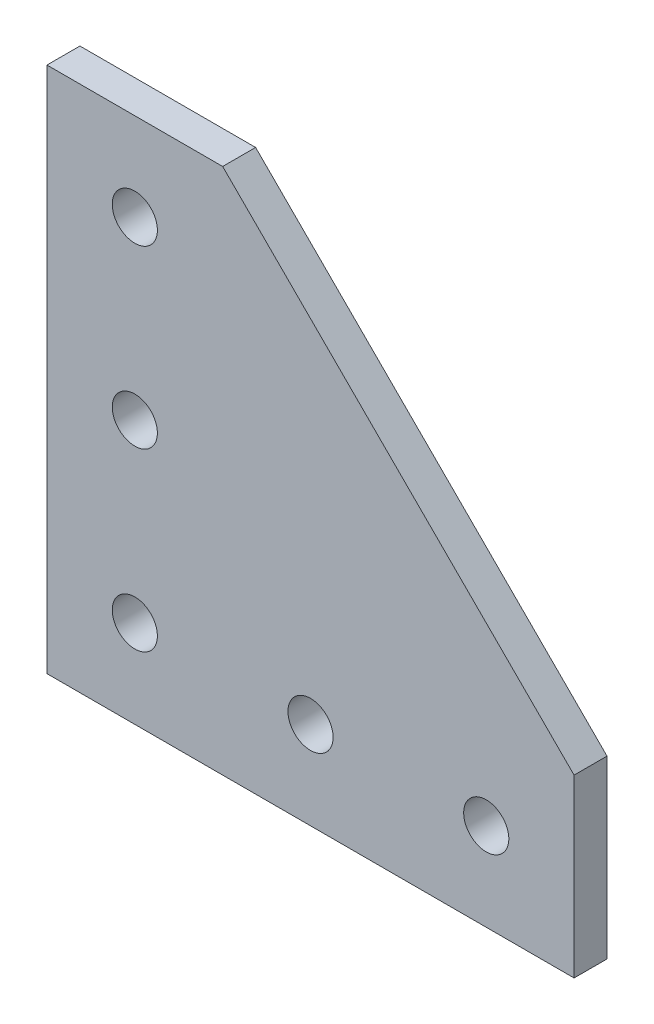
ISO-10303-21;
HEADER;
FILE_DESCRIPTION(('STEP AP214'),'2;1');
FILE_NAME('part.step','',(''),(''),'','','');
FILE_SCHEMA(('AUTOMOTIVE_DESIGN { 1 0 10303 214 1 1 1 1 }'));
ENDSEC;
DATA;
#1=APPLICATION_CONTEXT('core data for automotive mechanical design processes');
#2=APPLICATION_PROTOCOL_DEFINITION('international standard','automotive_design',2000,#1);
#3=PRODUCT_CONTEXT('',#1,'mechanical');
#4=PRODUCT('Part','Part','',(#3));
#5=PRODUCT_RELATED_PRODUCT_CATEGORY('part','',(#4));
#6=PRODUCT_DEFINITION_FORMATION('','',#4);
#7=PRODUCT_DEFINITION_CONTEXT('part definition',#1,'design');
#8=PRODUCT_DEFINITION('design','',#6,#7);
#9=PRODUCT_DEFINITION_SHAPE('','',#8);
#10=(LENGTH_UNIT() NAMED_UNIT(*) SI_UNIT(.MILLI.,.METRE.));
#11=(NAMED_UNIT(*) PLANE_ANGLE_UNIT() SI_UNIT($,.RADIAN.));
#12=(NAMED_UNIT(*) SI_UNIT($,.STERADIAN.) SOLID_ANGLE_UNIT());
#13=UNCERTAINTY_MEASURE_WITH_UNIT(LENGTH_MEASURE(1.E-05),#10,'distance_accuracy_value','');
#14=(GEOMETRIC_REPRESENTATION_CONTEXT(3) GLOBAL_UNCERTAINTY_ASSIGNED_CONTEXT((#13)) GLOBAL_UNIT_ASSIGNED_CONTEXT((#10,
#11,#12)) REPRESENTATION_CONTEXT('',''));
#15=CARTESIAN_POINT('',(0.,0.,0.));
#16=DIRECTION('',(0.,0.,1.));
#17=DIRECTION('',(1.,0.,0.));
#18=AXIS2_PLACEMENT_3D('',#15,#16,#17);
#19=CARTESIAN_POINT('',(0.,0.,2.38125));
#20=DIRECTION('',(0.,0.,-1.));
#21=DIRECTION('',(-1.,0.,0.));
#22=AXIS2_PLACEMENT_3D('',#19,#20,#21);
#23=PLANE('',#22);
#24=CARTESIAN_POINT('',(12.7,63.5,2.38125));
#25=DIRECTION('',(0.,0.,1.));
#26=DIRECTION('',(1.,0.,0.));
#27=AXIS2_PLACEMENT_3D('',#24,#25,#26);
#28=CIRCLE('',#27,3.2639);
#29=CARTESIAN_POINT('',(9.4361,63.5,2.38125));
#30=VERTEX_POINT('',#29);
#31=EDGE_CURVE('E174',#30,#30,#28,.T.);
#32=ORIENTED_EDGE('',*,*,#31,.F.);
#33=EDGE_LOOP('',(#32));
#34=FACE_BOUND('',#33,.T.);
#35=CARTESIAN_POINT('',(38.1,12.7,2.38125));
#36=DIRECTION('',(0.,0.,1.));
#37=DIRECTION('',(1.,0.,0.));
#38=AXIS2_PLACEMENT_3D('',#35,#36,#37);
#39=CIRCLE('',#38,3.26389999999999);
#40=CARTESIAN_POINT('',(34.8361,12.7,2.38125));
#41=VERTEX_POINT('',#40);
#42=EDGE_CURVE('E186',#41,#41,#39,.T.);
#43=ORIENTED_EDGE('',*,*,#42,.F.);
#44=EDGE_LOOP('',(#43));
#45=FACE_BOUND('',#44,.T.);
#46=DIRECTION('',(1.,0.,0.));
#47=VECTOR('',#46,1.);
#48=CARTESIAN_POINT('',(76.2,0.,2.38125));
#49=LINE('',#48,#47);
#50=CARTESIAN_POINT('',(0.,0.,2.38125));
#51=VERTEX_POINT('',#50);
#52=CARTESIAN_POINT('',(76.2,0.,2.38125));
#53=VERTEX_POINT('',#52);
#54=EDGE_CURVE('E114',#51,#53,#49,.T.);
#55=ORIENTED_EDGE('',*,*,#54,.T.);
#56=DIRECTION('',(0.,1.,0.));
#57=VECTOR('',#56,1.);
#58=CARTESIAN_POINT('',(76.2,25.4,2.38125));
#59=LINE('',#58,#57);
#60=CARTESIAN_POINT('',(76.2,25.4,2.38125));
#61=VERTEX_POINT('',#60);
#62=EDGE_CURVE('E81',#53,#61,#59,.T.);
#63=ORIENTED_EDGE('',*,*,#62,.T.);
#64=DIRECTION('',(-0.707106781186547,0.707106781186547,0.));
#65=VECTOR('',#64,1.);
#66=CARTESIAN_POINT('',(76.2,25.4,2.38125));
#67=LINE('',#66,#65);
#68=CARTESIAN_POINT('',(25.4,76.2,2.38125));
#69=VERTEX_POINT('',#68);
#70=EDGE_CURVE('E85',#61,#69,#67,.T.);
#71=ORIENTED_EDGE('',*,*,#70,.T.);
#72=DIRECTION('',(-1.,0.,0.));
#73=VECTOR('',#72,1.);
#74=CARTESIAN_POINT('',(0.,76.2,2.38125));
#75=LINE('',#74,#73);
#76=CARTESIAN_POINT('',(0.,76.2,2.38125));
#77=VERTEX_POINT('',#76);
#78=EDGE_CURVE('E89',#69,#77,#75,.T.);
#79=ORIENTED_EDGE('',*,*,#78,.T.);
#80=DIRECTION('',(0.,-1.,0.));
#81=VECTOR('',#80,1.);
#82=CARTESIAN_POINT('',(0.,0.,2.38125));
#83=LINE('',#82,#81);
#84=EDGE_CURVE('E47',#77,#51,#83,.T.);
#85=ORIENTED_EDGE('',*,*,#84,.T.);
#86=EDGE_LOOP('',(#55,#63,#71,#79,#85));
#87=FACE_BOUND('',#86,.T.);
#88=CARTESIAN_POINT('',(12.7,12.7,2.38125));
#89=DIRECTION('',(0.,0.,1.));
#90=DIRECTION('',(1.,0.,0.));
#91=AXIS2_PLACEMENT_3D('',#88,#89,#90);
#92=CIRCLE('',#91,3.2639);
#93=CARTESIAN_POINT('',(9.4361,12.7,2.38125));
#94=VERTEX_POINT('',#93);
#95=EDGE_CURVE('E109',#94,#94,#92,.T.);
#96=ORIENTED_EDGE('',*,*,#95,.F.);
#97=EDGE_LOOP('',(#96));
#98=FACE_BOUND('',#97,.T.);
#99=CARTESIAN_POINT('',(63.5,12.7,2.38125));
#100=DIRECTION('',(0.,0.,1.));
#101=DIRECTION('',(1.,0.,0.));
#102=AXIS2_PLACEMENT_3D('',#99,#100,#101);
#103=CIRCLE('',#102,3.26389999999999);
#104=CARTESIAN_POINT('',(60.2361,12.7,2.38125));
#105=VERTEX_POINT('',#104);
#106=EDGE_CURVE('E180',#105,#105,#103,.T.);
#107=ORIENTED_EDGE('',*,*,#106,.F.);
#108=EDGE_LOOP('',(#107));
#109=FACE_BOUND('',#108,.T.);
#110=CARTESIAN_POINT('',(12.7,38.1,2.38125));
#111=DIRECTION('',(0.,0.,1.));
#112=DIRECTION('',(1.,0.,0.));
#113=AXIS2_PLACEMENT_3D('',#110,#111,#112);
#114=CIRCLE('',#113,3.26389999999999);
#115=CARTESIAN_POINT('',(9.43610000000001,38.1,2.38125));
#116=VERTEX_POINT('',#115);
#117=EDGE_CURVE('E165',#116,#116,#114,.T.);
#118=ORIENTED_EDGE('',*,*,#117,.F.);
#119=EDGE_LOOP('',(#118));
#120=FACE_BOUND('',#119,.T.);
#121=ADVANCED_FACE('F30',(#34,#45,#87,#98,#109,#120),#23,.F.);
#122=CARTESIAN_POINT('',(0.,0.,-2.38125));
#123=DIRECTION('',(0.,0.,-1.));
#124=DIRECTION('',(-1.,0.,0.));
#125=AXIS2_PLACEMENT_3D('',#122,#123,#124);
#126=PLANE('',#125);
#127=CARTESIAN_POINT('',(12.7,63.5,-2.38125));
#128=DIRECTION('',(0.,0.,1.));
#129=DIRECTION('',(1.,0.,0.));
#130=AXIS2_PLACEMENT_3D('',#127,#128,#129);
#131=CIRCLE('',#130,3.2639);
#132=CARTESIAN_POINT('',(9.4361,63.5,-2.38125));
#133=VERTEX_POINT('',#132);
#134=EDGE_CURVE('E171',#133,#133,#131,.T.);
#135=ORIENTED_EDGE('',*,*,#134,.T.);
#136=EDGE_LOOP('',(#135));
#137=FACE_BOUND('',#136,.T.);
#138=CARTESIAN_POINT('',(38.1,12.7,-2.38125));
#139=DIRECTION('',(0.,0.,1.));
#140=DIRECTION('',(1.,0.,0.));
#141=AXIS2_PLACEMENT_3D('',#138,#139,#140);
#142=CIRCLE('',#141,3.26389999999999);
#143=CARTESIAN_POINT('',(34.8361,12.7,-2.38125));
#144=VERTEX_POINT('',#143);
#145=EDGE_CURVE('E183',#144,#144,#142,.T.);
#146=ORIENTED_EDGE('',*,*,#145,.T.);
#147=EDGE_LOOP('',(#146));
#148=FACE_BOUND('',#147,.T.);
#149=DIRECTION('',(1.,0.,0.));
#150=VECTOR('',#149,1.);
#151=CARTESIAN_POINT('',(76.2,0.,-2.38125));
#152=LINE('',#151,#150);
#153=CARTESIAN_POINT('',(0.,0.,-2.38125));
#154=VERTEX_POINT('',#153);
#155=CARTESIAN_POINT('',(76.2,0.,-2.38125));
#156=VERTEX_POINT('',#155);
#157=EDGE_CURVE('E105',#154,#156,#152,.T.);
#158=ORIENTED_EDGE('',*,*,#157,.F.);
#159=DIRECTION('',(0.,-1.,0.));
#160=VECTOR('',#159,1.);
#161=CARTESIAN_POINT('',(0.,0.,-2.38125));
#162=LINE('',#161,#160);
#163=CARTESIAN_POINT('',(0.,76.2,-2.38125));
#164=VERTEX_POINT('',#163);
#165=EDGE_CURVE('E73',#164,#154,#162,.T.);
#166=ORIENTED_EDGE('',*,*,#165,.F.);
#167=DIRECTION('',(-1.,0.,0.));
#168=VECTOR('',#167,1.);
#169=CARTESIAN_POINT('',(0.,76.2,-2.38125));
#170=LINE('',#169,#168);
#171=CARTESIAN_POINT('',(25.4,76.2,-2.38125));
#172=VERTEX_POINT('',#171);
#173=EDGE_CURVE('E67',#172,#164,#170,.T.);
#174=ORIENTED_EDGE('',*,*,#173,.F.);
#175=DIRECTION('',(-0.707106781186547,0.707106781186547,0.));
#176=VECTOR('',#175,1.);
#177=CARTESIAN_POINT('',(76.2,25.4,-2.38125));
#178=LINE('',#177,#176);
#179=CARTESIAN_POINT('',(76.2,25.4,-2.38125));
#180=VERTEX_POINT('',#179);
#181=EDGE_CURVE('E96',#180,#172,#178,.T.);
#182=ORIENTED_EDGE('',*,*,#181,.F.);
#183=DIRECTION('',(0.,1.,0.));
#184=VECTOR('',#183,1.);
#185=CARTESIAN_POINT('',(76.2,25.4,-2.38125));
#186=LINE('',#185,#184);
#187=EDGE_CURVE('E108',#156,#180,#186,.T.);
#188=ORIENTED_EDGE('',*,*,#187,.F.);
#189=EDGE_LOOP('',(#158,#166,#174,#182,#188));
#190=FACE_BOUND('',#189,.T.);
#191=CARTESIAN_POINT('',(12.7,12.7,-2.38125));
#192=DIRECTION('',(0.,0.,1.));
#193=DIRECTION('',(1.,0.,0.));
#194=AXIS2_PLACEMENT_3D('',#191,#192,#193);
#195=CIRCLE('',#194,3.2639);
#196=CARTESIAN_POINT('',(9.4361,12.7,-2.38125));
#197=VERTEX_POINT('',#196);
#198=EDGE_CURVE('E189',#197,#197,#195,.T.);
#199=ORIENTED_EDGE('',*,*,#198,.T.);
#200=EDGE_LOOP('',(#199));
#201=FACE_BOUND('',#200,.T.);
#202=CARTESIAN_POINT('',(63.5,12.7,-2.38125));
#203=DIRECTION('',(0.,0.,1.));
#204=DIRECTION('',(1.,0.,0.));
#205=AXIS2_PLACEMENT_3D('',#202,#203,#204);
#206=CIRCLE('',#205,3.26389999999999);
#207=CARTESIAN_POINT('',(60.2361,12.7,-2.38125));
#208=VERTEX_POINT('',#207);
#209=EDGE_CURVE('E177',#208,#208,#206,.T.);
#210=ORIENTED_EDGE('',*,*,#209,.T.);
#211=EDGE_LOOP('',(#210));
#212=FACE_BOUND('',#211,.T.);
#213=CARTESIAN_POINT('',(12.7,38.1,-2.38125));
#214=DIRECTION('',(0.,0.,1.));
#215=DIRECTION('',(1.,0.,0.));
#216=AXIS2_PLACEMENT_3D('',#213,#214,#215);
#217=CIRCLE('',#216,3.26389999999999);
#218=CARTESIAN_POINT('',(9.43610000000001,38.1,-2.38125));
#219=VERTEX_POINT('',#218);
#220=EDGE_CURVE('E168',#219,#219,#217,.T.);
#221=ORIENTED_EDGE('',*,*,#220,.T.);
#222=EDGE_LOOP('',(#221));
#223=FACE_BOUND('',#222,.T.);
#224=ADVANCED_FACE('F118',(#137,#148,#190,#201,#212,#223),#126,.T.);
#225=CARTESIAN_POINT('',(76.2,0.,2.38125));
#226=DIRECTION('',(0.,1.,0.));
#227=DIRECTION('',(-1.,0.,0.));
#228=AXIS2_PLACEMENT_3D('',#225,#226,#227);
#229=PLANE('',#228);
#230=ORIENTED_EDGE('',*,*,#157,.T.);
#231=DIRECTION('',(0.,0.,-1.));
#232=VECTOR('',#231,1.);
#233=CARTESIAN_POINT('',(76.2,0.,2.38125));
#234=LINE('',#233,#232);
#235=EDGE_CURVE('E11',#53,#156,#234,.T.);
#236=ORIENTED_EDGE('',*,*,#235,.F.);
#237=ORIENTED_EDGE('',*,*,#54,.F.);
#238=DIRECTION('',(0.,0.,-1.));
#239=VECTOR('',#238,1.);
#240=CARTESIAN_POINT('',(0.,0.,2.38125));
#241=LINE('',#240,#239);
#242=EDGE_CURVE('E101',#51,#154,#241,.T.);
#243=ORIENTED_EDGE('',*,*,#242,.T.);
#244=EDGE_LOOP('',(#230,#236,#237,#243));
#245=FACE_BOUND('',#244,.T.);
#246=ADVANCED_FACE('F32',(#245),#229,.F.);
#247=CARTESIAN_POINT('',(76.2,25.4,2.38125));
#248=DIRECTION('',(-1.,0.,0.));
#249=DIRECTION('',(0.,0.,1.));
#250=AXIS2_PLACEMENT_3D('',#247,#248,#249);
#251=PLANE('',#250);
#252=ORIENTED_EDGE('',*,*,#187,.T.);
#253=DIRECTION('',(0.,0.,-1.));
#254=VECTOR('',#253,1.);
#255=CARTESIAN_POINT('',(76.2,25.4,2.38125));
#256=LINE('',#255,#254);
#257=EDGE_CURVE('E39',#61,#180,#256,.T.);
#258=ORIENTED_EDGE('',*,*,#257,.F.);
#259=ORIENTED_EDGE('',*,*,#62,.F.);
#260=ORIENTED_EDGE('',*,*,#235,.T.);
#261=EDGE_LOOP('',(#252,#258,#259,#260));
#262=FACE_BOUND('',#261,.T.);
#263=ADVANCED_FACE('F246',(#262),#251,.F.);
#264=CARTESIAN_POINT('',(76.2,25.4,2.38125));
#265=DIRECTION('',(-0.707106781186547,-0.707106781186547,0.));
#266=DIRECTION('',(0.707106781186548,-0.707106781186548,0.));
#267=AXIS2_PLACEMENT_3D('',#264,#265,#266);
#268=PLANE('',#267);
#269=ORIENTED_EDGE('',*,*,#181,.T.);
#270=DIRECTION('',(0.,0.,-1.));
#271=VECTOR('',#270,1.);
#272=CARTESIAN_POINT('',(25.4,76.2,2.38125));
#273=LINE('',#272,#271);
#274=EDGE_CURVE('E93',#69,#172,#273,.T.);
#275=ORIENTED_EDGE('',*,*,#274,.F.);
#276=ORIENTED_EDGE('',*,*,#70,.F.);
#277=ORIENTED_EDGE('',*,*,#257,.T.);
#278=EDGE_LOOP('',(#269,#275,#276,#277));
#279=FACE_BOUND('',#278,.T.);
#280=ADVANCED_FACE('F94',(#279),#268,.F.);
#281=CARTESIAN_POINT('',(0.,76.2,2.38125));
#282=DIRECTION('',(0.,-1.,0.));
#283=DIRECTION('',(0.,0.,-1.));
#284=AXIS2_PLACEMENT_3D('',#281,#282,#283);
#285=PLANE('',#284);
#286=ORIENTED_EDGE('',*,*,#173,.T.);
#287=DIRECTION('',(0.,0.,-1.));
#288=VECTOR('',#287,1.);
#289=CARTESIAN_POINT('',(0.,76.2,2.38125));
#290=LINE('',#289,#288);
#291=EDGE_CURVE('E97',#77,#164,#290,.T.);
#292=ORIENTED_EDGE('',*,*,#291,.F.);
#293=ORIENTED_EDGE('',*,*,#78,.F.);
#294=ORIENTED_EDGE('',*,*,#274,.T.);
#295=EDGE_LOOP('',(#286,#292,#293,#294));
#296=FACE_BOUND('',#295,.T.);
#297=ADVANCED_FACE('F99',(#296),#285,.F.);
#298=CARTESIAN_POINT('',(0.,0.,2.38125));
#299=DIRECTION('',(1.,0.,0.));
#300=DIRECTION('',(0.,0.,-1.));
#301=AXIS2_PLACEMENT_3D('',#298,#299,#300);
#302=PLANE('',#301);
#303=ORIENTED_EDGE('',*,*,#165,.T.);
#304=ORIENTED_EDGE('',*,*,#242,.F.);
#305=ORIENTED_EDGE('',*,*,#84,.F.);
#306=ORIENTED_EDGE('',*,*,#291,.T.);
#307=EDGE_LOOP('',(#303,#304,#305,#306));
#308=FACE_BOUND('',#307,.T.);
#309=ADVANCED_FACE('F123',(#308),#302,.F.);
#310=CARTESIAN_POINT('',(12.7,12.7,2.38125));
#311=DIRECTION('',(0.,0.,-1.));
#312=DIRECTION('',(-1.,0.,0.));
#313=AXIS2_PLACEMENT_3D('',#310,#311,#312);
#314=CYLINDRICAL_SURFACE('',#313,3.2639);
#315=CARTESIAN_POINT('',(9.4361,12.7,2.38125));
#316=CARTESIAN_POINT('',(9.4361,12.7,2.331640625));
#317=CARTESIAN_POINT('',(9.4361,12.7,2.28203125));
#318=CARTESIAN_POINT('',(9.4361,12.7,2.1828125));
#319=CARTESIAN_POINT('',(9.4361,12.7,2.133203125));
#320=CARTESIAN_POINT('',(9.4361,12.7,2.033984375));
#321=CARTESIAN_POINT('',(9.4361,12.7,1.984375));
#322=CARTESIAN_POINT('',(9.4361,12.7,1.88515625));
#323=CARTESIAN_POINT('',(9.4361,12.7,1.835546875));
#324=CARTESIAN_POINT('',(9.4361,12.7,1.736328125));
#325=CARTESIAN_POINT('',(9.4361,12.7,1.68671875));
#326=CARTESIAN_POINT('',(9.4361,12.7,1.5875));
#327=CARTESIAN_POINT('',(9.4361,12.7,1.537890625));
#328=CARTESIAN_POINT('',(9.4361,12.7,1.438671875));
#329=CARTESIAN_POINT('',(9.4361,12.7,1.3890625));
#330=CARTESIAN_POINT('',(9.4361,12.7,1.28984375));
#331=CARTESIAN_POINT('',(9.4361,12.7,1.240234375));
#332=CARTESIAN_POINT('',(9.4361,12.7,1.141015625));
#333=CARTESIAN_POINT('',(9.4361,12.7,1.09140625));
#334=CARTESIAN_POINT('',(9.4361,12.7,0.9921875));
#335=CARTESIAN_POINT('',(9.4361,12.7,0.942578125));
#336=CARTESIAN_POINT('',(9.4361,12.7,0.843359375));
#337=CARTESIAN_POINT('',(9.4361,12.7,0.79375));
#338=CARTESIAN_POINT('',(9.4361,12.7,0.69453125));
#339=CARTESIAN_POINT('',(9.4361,12.7,0.644921875));
#340=CARTESIAN_POINT('',(9.4361,12.7,0.545703125));
#341=CARTESIAN_POINT('',(9.4361,12.7,0.49609375));
#342=CARTESIAN_POINT('',(9.4361,12.7,0.396875));
#343=CARTESIAN_POINT('',(9.4361,12.7,0.347265625));
#344=CARTESIAN_POINT('',(9.4361,12.7,0.248046875));
#345=CARTESIAN_POINT('',(9.4361,12.7,0.1984375));
#346=CARTESIAN_POINT('',(9.4361,12.7,0.0992187499999996));
#347=CARTESIAN_POINT('',(9.4361,12.7,0.0496093749999996));
#348=CARTESIAN_POINT('',(9.4361,12.7,-0.0496093750000005));
#349=CARTESIAN_POINT('',(9.4361,12.7,-0.0992187500000005));
#350=CARTESIAN_POINT('',(9.4361,12.7,-0.198437500000001));
#351=CARTESIAN_POINT('',(9.4361,12.7,-0.248046875000001));
#352=CARTESIAN_POINT('',(9.4361,12.7,-0.347265625000001));
#353=CARTESIAN_POINT('',(9.4361,12.7,-0.396875000000001));
#354=CARTESIAN_POINT('',(9.4361,12.7,-0.496093750000001));
#355=CARTESIAN_POINT('',(9.4361,12.7,-0.545703125000001));
#356=CARTESIAN_POINT('',(9.4361,12.7,-0.644921875000001));
#357=CARTESIAN_POINT('',(9.4361,12.7,-0.694531250000001));
#358=CARTESIAN_POINT('',(9.4361,12.7,-0.793750000000001));
#359=CARTESIAN_POINT('',(9.4361,12.7,-0.843359375));
#360=CARTESIAN_POINT('',(9.4361,12.7,-0.942578125000001));
#361=CARTESIAN_POINT('',(9.4361,12.7,-0.992187500000001));
#362=CARTESIAN_POINT('',(9.4361,12.7,-1.09140625));
#363=CARTESIAN_POINT('',(9.4361,12.7,-1.141015625));
#364=CARTESIAN_POINT('',(9.4361,12.7,-1.240234375));
#365=CARTESIAN_POINT('',(9.4361,12.7,-1.28984375));
#366=CARTESIAN_POINT('',(9.4361,12.7,-1.3890625));
#367=CARTESIAN_POINT('',(9.4361,12.7,-1.438671875));
#368=CARTESIAN_POINT('',(9.4361,12.7,-1.537890625));
#369=CARTESIAN_POINT('',(9.4361,12.7,-1.5875));
#370=CARTESIAN_POINT('',(9.4361,12.7,-1.68671875));
#371=CARTESIAN_POINT('',(9.4361,12.7,-1.736328125));
#372=CARTESIAN_POINT('',(9.4361,12.7,-1.835546875));
#373=CARTESIAN_POINT('',(9.4361,12.7,-1.88515625));
#374=CARTESIAN_POINT('',(9.4361,12.7,-1.984375));
#375=CARTESIAN_POINT('',(9.4361,12.7,-2.033984375));
#376=CARTESIAN_POINT('',(9.4361,12.7,-2.133203125));
#377=CARTESIAN_POINT('',(9.4361,12.7,-2.1828125));
#378=CARTESIAN_POINT('',(9.4361,12.7,-2.28203125));
#379=CARTESIAN_POINT('',(9.4361,12.7,-2.331640625));
#380=CARTESIAN_POINT('',(9.4361,12.7,-2.38125));
#381=B_SPLINE_CURVE_WITH_KNOTS('',3,(#315,#316,#317,#318,#319,#320,#321,#322,#323,#324,#325,
#326,#327,#328,#329,#330,#331,#332,#333,#334,#335,#336,#337,#338,#339,#340,#341,#342,#343,#344,
#345,#346,#347,#348,#349,#350,#351,#352,#353,#354,#355,#356,#357,#358,#359,#360,#361,#362,#363,
#364,#365,#366,#367,#368,#369,#370,#371,#372,#373,#374,#375,#376,#377,#378,#379,#380),
.UNSPECIFIED.,.F.,.F.,(4,2,2,2,2,2,2,2,2,2,2,2,2,2,2,2,2,2,2,2,2,2,2,2,2,2,2,2,2,2,2,2,4),(0.,
0.148828125,0.29765625,0.446484375,0.5953125,0.744140625,0.89296875,1.041796875,1.190625,
1.339453125,1.48828125,1.637109375,1.7859375,1.934765625,2.08359375,2.232421875,2.38125,
2.530078125,2.67890625,2.827734375,2.9765625,3.125390625,3.27421875,3.423046875,3.571875,
3.720703125,3.86953125,4.018359375,4.1671875,4.316015625,4.46484375,4.613671875,4.7625),.UNSPECIFIED.);
#382=EDGE_CURVE('BSEAM125',#94,#197,#381,.T.);
#383=ORIENTED_EDGE('',*,*,#95,.T.);
#384=ORIENTED_EDGE('',*,*,#198,.F.);
#385=ORIENTED_EDGE('',*,*,#382,.T.);
#386=ORIENTED_EDGE('',*,*,#382,.F.);
#387=EDGE_LOOP('',(#383,#385,#384,#386));
#388=FACE_BOUND('',#387,.T.);
#389=ADVANCED_FACE('F125',(#388),#314,.F.);
#390=CARTESIAN_POINT('',(38.1,12.7,2.38125));
#391=DIRECTION('',(0.,0.,-1.));
#392=DIRECTION('',(-1.,0.,0.));
#393=AXIS2_PLACEMENT_3D('',#390,#391,#392);
#394=CYLINDRICAL_SURFACE('',#393,3.26389999999999);
#395=CARTESIAN_POINT('',(34.8361,12.7,2.38125));
#396=CARTESIAN_POINT('',(34.8361,12.7,2.331640625));
#397=CARTESIAN_POINT('',(34.8361,12.7,2.28203125));
#398=CARTESIAN_POINT('',(34.8361,12.7,2.1828125));
#399=CARTESIAN_POINT('',(34.8361,12.7,2.133203125));
#400=CARTESIAN_POINT('',(34.8361,12.7,2.033984375));
#401=CARTESIAN_POINT('',(34.8361,12.7,1.984375));
#402=CARTESIAN_POINT('',(34.8361,12.7,1.88515625));
#403=CARTESIAN_POINT('',(34.8361,12.7,1.835546875));
#404=CARTESIAN_POINT('',(34.8361,12.7,1.736328125));
#405=CARTESIAN_POINT('',(34.8361,12.7,1.68671875));
#406=CARTESIAN_POINT('',(34.8361,12.7,1.5875));
#407=CARTESIAN_POINT('',(34.8361,12.7,1.537890625));
#408=CARTESIAN_POINT('',(34.8361,12.7,1.438671875));
#409=CARTESIAN_POINT('',(34.8361,12.7,1.3890625));
#410=CARTESIAN_POINT('',(34.8361,12.7,1.28984375));
#411=CARTESIAN_POINT('',(34.8361,12.7,1.240234375));
#412=CARTESIAN_POINT('',(34.8361,12.7,1.141015625));
#413=CARTESIAN_POINT('',(34.8361,12.7,1.09140625));
#414=CARTESIAN_POINT('',(34.8361,12.7,0.9921875));
#415=CARTESIAN_POINT('',(34.8361,12.7,0.942578125));
#416=CARTESIAN_POINT('',(34.8361,12.7,0.843359375));
#417=CARTESIAN_POINT('',(34.8361,12.7,0.79375));
#418=CARTESIAN_POINT('',(34.8361,12.7,0.69453125));
#419=CARTESIAN_POINT('',(34.8361,12.7,0.644921875));
#420=CARTESIAN_POINT('',(34.8361,12.7,0.545703125));
#421=CARTESIAN_POINT('',(34.8361,12.7,0.49609375));
#422=CARTESIAN_POINT('',(34.8361,12.7,0.396875));
#423=CARTESIAN_POINT('',(34.8361,12.7,0.347265625));
#424=CARTESIAN_POINT('',(34.8361,12.7,0.248046875));
#425=CARTESIAN_POINT('',(34.8361,12.7,0.1984375));
#426=CARTESIAN_POINT('',(34.8361,12.7,0.0992187499999996));
#427=CARTESIAN_POINT('',(34.8361,12.7,0.0496093749999996));
#428=CARTESIAN_POINT('',(34.8361,12.7,-0.0496093750000005));
#429=CARTESIAN_POINT('',(34.8361,12.7,-0.0992187500000005));
#430=CARTESIAN_POINT('',(34.8361,12.7,-0.198437500000001));
#431=CARTESIAN_POINT('',(34.8361,12.7,-0.248046875000001));
#432=CARTESIAN_POINT('',(34.8361,12.7,-0.347265625000001));
#433=CARTESIAN_POINT('',(34.8361,12.7,-0.396875000000001));
#434=CARTESIAN_POINT('',(34.8361,12.7,-0.496093750000001));
#435=CARTESIAN_POINT('',(34.8361,12.7,-0.545703125000001));
#436=CARTESIAN_POINT('',(34.8361,12.7,-0.644921875000001));
#437=CARTESIAN_POINT('',(34.8361,12.7,-0.694531250000001));
#438=CARTESIAN_POINT('',(34.8361,12.7,-0.793750000000001));
#439=CARTESIAN_POINT('',(34.8361,12.7,-0.843359375));
#440=CARTESIAN_POINT('',(34.8361,12.7,-0.942578125000001));
#441=CARTESIAN_POINT('',(34.8361,12.7,-0.992187500000001));
#442=CARTESIAN_POINT('',(34.8361,12.7,-1.09140625));
#443=CARTESIAN_POINT('',(34.8361,12.7,-1.141015625));
#444=CARTESIAN_POINT('',(34.8361,12.7,-1.240234375));
#445=CARTESIAN_POINT('',(34.8361,12.7,-1.28984375));
#446=CARTESIAN_POINT('',(34.8361,12.7,-1.3890625));
#447=CARTESIAN_POINT('',(34.8361,12.7,-1.438671875));
#448=CARTESIAN_POINT('',(34.8361,12.7,-1.537890625));
#449=CARTESIAN_POINT('',(34.8361,12.7,-1.5875));
#450=CARTESIAN_POINT('',(34.8361,12.7,-1.68671875));
#451=CARTESIAN_POINT('',(34.8361,12.7,-1.736328125));
#452=CARTESIAN_POINT('',(34.8361,12.7,-1.835546875));
#453=CARTESIAN_POINT('',(34.8361,12.7,-1.88515625));
#454=CARTESIAN_POINT('',(34.8361,12.7,-1.984375));
#455=CARTESIAN_POINT('',(34.8361,12.7,-2.033984375));
#456=CARTESIAN_POINT('',(34.8361,12.7,-2.133203125));
#457=CARTESIAN_POINT('',(34.8361,12.7,-2.1828125));
#458=CARTESIAN_POINT('',(34.8361,12.7,-2.28203125));
#459=CARTESIAN_POINT('',(34.8361,12.7,-2.331640625));
#460=CARTESIAN_POINT('',(34.8361,12.7,-2.38125));
#461=B_SPLINE_CURVE_WITH_KNOTS('',3,(#395,#396,#397,#398,#399,#400,#401,#402,#403,#404,#405,
#406,#407,#408,#409,#410,#411,#412,#413,#414,#415,#416,#417,#418,#419,#420,#421,#422,#423,#424,
#425,#426,#427,#428,#429,#430,#431,#432,#433,#434,#435,#436,#437,#438,#439,#440,#441,#442,#443,
#444,#445,#446,#447,#448,#449,#450,#451,#452,#453,#454,#455,#456,#457,#458,#459,#460),
.UNSPECIFIED.,.F.,.F.,(4,2,2,2,2,2,2,2,2,2,2,2,2,2,2,2,2,2,2,2,2,2,2,2,2,2,2,2,2,2,2,2,4),(0.,
0.148828125,0.29765625,0.446484375,0.5953125,0.744140625,0.89296875,1.041796875,1.190625,
1.339453125,1.48828125,1.637109375,1.7859375,1.934765625,2.08359375,2.232421875,2.38125,
2.530078125,2.67890625,2.827734375,2.9765625,3.125390625,3.27421875,3.423046875,3.571875,
3.720703125,3.86953125,4.018359375,4.1671875,4.316015625,4.46484375,4.613671875,4.7625),.UNSPECIFIED.);
#462=EDGE_CURVE('BSEAM131',#41,#144,#461,.T.);
#463=ORIENTED_EDGE('',*,*,#42,.T.);
#464=ORIENTED_EDGE('',*,*,#145,.F.);
#465=ORIENTED_EDGE('',*,*,#462,.T.);
#466=ORIENTED_EDGE('',*,*,#462,.F.);
#467=EDGE_LOOP('',(#463,#465,#464,#466));
#468=FACE_BOUND('',#467,.T.);
#469=ADVANCED_FACE('F131',(#468),#394,.F.);
#470=CARTESIAN_POINT('',(63.5,12.7,2.38125));
#471=DIRECTION('',(0.,0.,-1.));
#472=DIRECTION('',(-1.,0.,0.));
#473=AXIS2_PLACEMENT_3D('',#470,#471,#472);
#474=CYLINDRICAL_SURFACE('',#473,3.26389999999999);
#475=CARTESIAN_POINT('',(60.2361,12.7,2.38125));
#476=CARTESIAN_POINT('',(60.2361,12.7,2.331640625));
#477=CARTESIAN_POINT('',(60.2361,12.7,2.28203125));
#478=CARTESIAN_POINT('',(60.2361,12.7,2.1828125));
#479=CARTESIAN_POINT('',(60.2361,12.7,2.133203125));
#480=CARTESIAN_POINT('',(60.2361,12.7,2.033984375));
#481=CARTESIAN_POINT('',(60.2361,12.7,1.984375));
#482=CARTESIAN_POINT('',(60.2361,12.7,1.88515625));
#483=CARTESIAN_POINT('',(60.2361,12.7,1.835546875));
#484=CARTESIAN_POINT('',(60.2361,12.7,1.736328125));
#485=CARTESIAN_POINT('',(60.2361,12.7,1.68671875));
#486=CARTESIAN_POINT('',(60.2361,12.7,1.5875));
#487=CARTESIAN_POINT('',(60.2361,12.7,1.537890625));
#488=CARTESIAN_POINT('',(60.2361,12.7,1.438671875));
#489=CARTESIAN_POINT('',(60.2361,12.7,1.3890625));
#490=CARTESIAN_POINT('',(60.2361,12.7,1.28984375));
#491=CARTESIAN_POINT('',(60.2361,12.7,1.240234375));
#492=CARTESIAN_POINT('',(60.2361,12.7,1.141015625));
#493=CARTESIAN_POINT('',(60.2361,12.7,1.09140625));
#494=CARTESIAN_POINT('',(60.2361,12.7,0.9921875));
#495=CARTESIAN_POINT('',(60.2361,12.7,0.942578125));
#496=CARTESIAN_POINT('',(60.2361,12.7,0.843359375));
#497=CARTESIAN_POINT('',(60.2361,12.7,0.79375));
#498=CARTESIAN_POINT('',(60.2361,12.7,0.69453125));
#499=CARTESIAN_POINT('',(60.2361,12.7,0.644921875));
#500=CARTESIAN_POINT('',(60.2361,12.7,0.545703125));
#501=CARTESIAN_POINT('',(60.2361,12.7,0.49609375));
#502=CARTESIAN_POINT('',(60.2361,12.7,0.396875));
#503=CARTESIAN_POINT('',(60.2361,12.7,0.347265625));
#504=CARTESIAN_POINT('',(60.2361,12.7,0.248046875));
#505=CARTESIAN_POINT('',(60.2361,12.7,0.1984375));
#506=CARTESIAN_POINT('',(60.2361,12.7,0.0992187499999996));
#507=CARTESIAN_POINT('',(60.2361,12.7,0.0496093749999996));
#508=CARTESIAN_POINT('',(60.2361,12.7,-0.0496093750000005));
#509=CARTESIAN_POINT('',(60.2361,12.7,-0.0992187500000005));
#510=CARTESIAN_POINT('',(60.2361,12.7,-0.198437500000001));
#511=CARTESIAN_POINT('',(60.2361,12.7,-0.248046875000001));
#512=CARTESIAN_POINT('',(60.2361,12.7,-0.347265625000001));
#513=CARTESIAN_POINT('',(60.2361,12.7,-0.396875000000001));
#514=CARTESIAN_POINT('',(60.2361,12.7,-0.496093750000001));
#515=CARTESIAN_POINT('',(60.2361,12.7,-0.545703125000001));
#516=CARTESIAN_POINT('',(60.2361,12.7,-0.644921875000001));
#517=CARTESIAN_POINT('',(60.2361,12.7,-0.694531250000001));
#518=CARTESIAN_POINT('',(60.2361,12.7,-0.793750000000001));
#519=CARTESIAN_POINT('',(60.2361,12.7,-0.843359375));
#520=CARTESIAN_POINT('',(60.2361,12.7,-0.942578125000001));
#521=CARTESIAN_POINT('',(60.2361,12.7,-0.992187500000001));
#522=CARTESIAN_POINT('',(60.2361,12.7,-1.09140625));
#523=CARTESIAN_POINT('',(60.2361,12.7,-1.141015625));
#524=CARTESIAN_POINT('',(60.2361,12.7,-1.240234375));
#525=CARTESIAN_POINT('',(60.2361,12.7,-1.28984375));
#526=CARTESIAN_POINT('',(60.2361,12.7,-1.3890625));
#527=CARTESIAN_POINT('',(60.2361,12.7,-1.438671875));
#528=CARTESIAN_POINT('',(60.2361,12.7,-1.537890625));
#529=CARTESIAN_POINT('',(60.2361,12.7,-1.5875));
#530=CARTESIAN_POINT('',(60.2361,12.7,-1.68671875));
#531=CARTESIAN_POINT('',(60.2361,12.7,-1.736328125));
#532=CARTESIAN_POINT('',(60.2361,12.7,-1.835546875));
#533=CARTESIAN_POINT('',(60.2361,12.7,-1.88515625));
#534=CARTESIAN_POINT('',(60.2361,12.7,-1.984375));
#535=CARTESIAN_POINT('',(60.2361,12.7,-2.033984375));
#536=CARTESIAN_POINT('',(60.2361,12.7,-2.133203125));
#537=CARTESIAN_POINT('',(60.2361,12.7,-2.1828125));
#538=CARTESIAN_POINT('',(60.2361,12.7,-2.28203125));
#539=CARTESIAN_POINT('',(60.2361,12.7,-2.331640625));
#540=CARTESIAN_POINT('',(60.2361,12.7,-2.38125));
#541=B_SPLINE_CURVE_WITH_KNOTS('',3,(#475,#476,#477,#478,#479,#480,#481,#482,#483,#484,#485,
#486,#487,#488,#489,#490,#491,#492,#493,#494,#495,#496,#497,#498,#499,#500,#501,#502,#503,#504,
#505,#506,#507,#508,#509,#510,#511,#512,#513,#514,#515,#516,#517,#518,#519,#520,#521,#522,#523,
#524,#525,#526,#527,#528,#529,#530,#531,#532,#533,#534,#535,#536,#537,#538,#539,#540),
.UNSPECIFIED.,.F.,.F.,(4,2,2,2,2,2,2,2,2,2,2,2,2,2,2,2,2,2,2,2,2,2,2,2,2,2,2,2,2,2,2,2,4),(0.,
0.148828125,0.29765625,0.446484375,0.5953125,0.744140625,0.89296875,1.041796875,1.190625,
1.339453125,1.48828125,1.637109375,1.7859375,1.934765625,2.08359375,2.232421875,2.38125,
2.530078125,2.67890625,2.827734375,2.9765625,3.125390625,3.27421875,3.423046875,3.571875,
3.720703125,3.86953125,4.018359375,4.1671875,4.316015625,4.46484375,4.613671875,4.7625),.UNSPECIFIED.);
#542=EDGE_CURVE('BSEAM148',#105,#208,#541,.T.);
#543=ORIENTED_EDGE('',*,*,#106,.T.);
#544=ORIENTED_EDGE('',*,*,#209,.F.);
#545=ORIENTED_EDGE('',*,*,#542,.T.);
#546=ORIENTED_EDGE('',*,*,#542,.F.);
#547=EDGE_LOOP('',(#543,#545,#544,#546));
#548=FACE_BOUND('',#547,.T.);
#549=ADVANCED_FACE('F148',(#548),#474,.F.);
#550=CARTESIAN_POINT('',(12.7,63.5,2.38125));
#551=DIRECTION('',(0.,0.,-1.));
#552=DIRECTION('',(-1.,0.,0.));
#553=AXIS2_PLACEMENT_3D('',#550,#551,#552);
#554=CYLINDRICAL_SURFACE('',#553,3.2639);
#555=CARTESIAN_POINT('',(9.4361,63.5,2.38125));
#556=CARTESIAN_POINT('',(9.4361,63.5,2.331640625));
#557=CARTESIAN_POINT('',(9.4361,63.5,2.28203125));
#558=CARTESIAN_POINT('',(9.4361,63.5,2.1828125));
#559=CARTESIAN_POINT('',(9.4361,63.5,2.133203125));
#560=CARTESIAN_POINT('',(9.4361,63.5,2.033984375));
#561=CARTESIAN_POINT('',(9.4361,63.5,1.984375));
#562=CARTESIAN_POINT('',(9.4361,63.5,1.88515625));
#563=CARTESIAN_POINT('',(9.4361,63.5,1.835546875));
#564=CARTESIAN_POINT('',(9.4361,63.5,1.736328125));
#565=CARTESIAN_POINT('',(9.4361,63.5,1.68671875));
#566=CARTESIAN_POINT('',(9.4361,63.5,1.5875));
#567=CARTESIAN_POINT('',(9.4361,63.5,1.537890625));
#568=CARTESIAN_POINT('',(9.4361,63.5,1.438671875));
#569=CARTESIAN_POINT('',(9.4361,63.5,1.3890625));
#570=CARTESIAN_POINT('',(9.4361,63.5,1.28984375));
#571=CARTESIAN_POINT('',(9.4361,63.5,1.240234375));
#572=CARTESIAN_POINT('',(9.4361,63.5,1.141015625));
#573=CARTESIAN_POINT('',(9.4361,63.5,1.09140625));
#574=CARTESIAN_POINT('',(9.4361,63.5,0.9921875));
#575=CARTESIAN_POINT('',(9.4361,63.5,0.942578125));
#576=CARTESIAN_POINT('',(9.4361,63.5,0.843359375));
#577=CARTESIAN_POINT('',(9.4361,63.5,0.79375));
#578=CARTESIAN_POINT('',(9.4361,63.5,0.69453125));
#579=CARTESIAN_POINT('',(9.4361,63.5,0.644921875));
#580=CARTESIAN_POINT('',(9.4361,63.5,0.545703125));
#581=CARTESIAN_POINT('',(9.4361,63.5,0.49609375));
#582=CARTESIAN_POINT('',(9.4361,63.5,0.396875));
#583=CARTESIAN_POINT('',(9.4361,63.5,0.347265625));
#584=CARTESIAN_POINT('',(9.4361,63.5,0.248046875));
#585=CARTESIAN_POINT('',(9.4361,63.5,0.1984375));
#586=CARTESIAN_POINT('',(9.4361,63.5,0.0992187499999996));
#587=CARTESIAN_POINT('',(9.4361,63.5,0.0496093749999996));
#588=CARTESIAN_POINT('',(9.4361,63.5,-0.0496093750000005));
#589=CARTESIAN_POINT('',(9.4361,63.5,-0.0992187500000005));
#590=CARTESIAN_POINT('',(9.4361,63.5,-0.198437500000001));
#591=CARTESIAN_POINT('',(9.4361,63.5,-0.248046875000001));
#592=CARTESIAN_POINT('',(9.4361,63.5,-0.347265625000001));
#593=CARTESIAN_POINT('',(9.4361,63.5,-0.396875000000001));
#594=CARTESIAN_POINT('',(9.4361,63.5,-0.496093750000001));
#595=CARTESIAN_POINT('',(9.4361,63.5,-0.545703125000001));
#596=CARTESIAN_POINT('',(9.4361,63.5,-0.644921875000001));
#597=CARTESIAN_POINT('',(9.4361,63.5,-0.694531250000001));
#598=CARTESIAN_POINT('',(9.4361,63.5,-0.793750000000001));
#599=CARTESIAN_POINT('',(9.4361,63.5,-0.843359375));
#600=CARTESIAN_POINT('',(9.4361,63.5,-0.942578125000001));
#601=CARTESIAN_POINT('',(9.4361,63.5,-0.992187500000001));
#602=CARTESIAN_POINT('',(9.4361,63.5,-1.09140625));
#603=CARTESIAN_POINT('',(9.4361,63.5,-1.141015625));
#604=CARTESIAN_POINT('',(9.4361,63.5,-1.240234375));
#605=CARTESIAN_POINT('',(9.4361,63.5,-1.28984375));
#606=CARTESIAN_POINT('',(9.4361,63.5,-1.3890625));
#607=CARTESIAN_POINT('',(9.4361,63.5,-1.438671875));
#608=CARTESIAN_POINT('',(9.4361,63.5,-1.537890625));
#609=CARTESIAN_POINT('',(9.4361,63.5,-1.5875));
#610=CARTESIAN_POINT('',(9.4361,63.5,-1.68671875));
#611=CARTESIAN_POINT('',(9.4361,63.5,-1.736328125));
#612=CARTESIAN_POINT('',(9.4361,63.5,-1.835546875));
#613=CARTESIAN_POINT('',(9.4361,63.5,-1.88515625));
#614=CARTESIAN_POINT('',(9.4361,63.5,-1.984375));
#615=CARTESIAN_POINT('',(9.4361,63.5,-2.033984375));
#616=CARTESIAN_POINT('',(9.4361,63.5,-2.133203125));
#617=CARTESIAN_POINT('',(9.4361,63.5,-2.1828125));
#618=CARTESIAN_POINT('',(9.4361,63.5,-2.28203125));
#619=CARTESIAN_POINT('',(9.4361,63.5,-2.331640625));
#620=CARTESIAN_POINT('',(9.4361,63.5,-2.38125));
#621=B_SPLINE_CURVE_WITH_KNOTS('',3,(#555,#556,#557,#558,#559,#560,#561,#562,#563,#564,#565,
#566,#567,#568,#569,#570,#571,#572,#573,#574,#575,#576,#577,#578,#579,#580,#581,#582,#583,#584,
#585,#586,#587,#588,#589,#590,#591,#592,#593,#594,#595,#596,#597,#598,#599,#600,#601,#602,#603,
#604,#605,#606,#607,#608,#609,#610,#611,#612,#613,#614,#615,#616,#617,#618,#619,#620),
.UNSPECIFIED.,.F.,.F.,(4,2,2,2,2,2,2,2,2,2,2,2,2,2,2,2,2,2,2,2,2,2,2,2,2,2,2,2,2,2,2,2,4),(0.,
0.148828125,0.29765625,0.446484375,0.5953125,0.744140625,0.89296875,1.041796875,1.190625,
1.339453125,1.48828125,1.637109375,1.7859375,1.934765625,2.08359375,2.232421875,2.38125,
2.530078125,2.67890625,2.827734375,2.9765625,3.125390625,3.27421875,3.423046875,3.571875,
3.720703125,3.86953125,4.018359375,4.1671875,4.316015625,4.46484375,4.613671875,4.7625),.UNSPECIFIED.);
#622=EDGE_CURVE('BSEAM152',#30,#133,#621,.T.);
#623=ORIENTED_EDGE('',*,*,#31,.T.);
#624=ORIENTED_EDGE('',*,*,#134,.F.);
#625=ORIENTED_EDGE('',*,*,#622,.T.);
#626=ORIENTED_EDGE('',*,*,#622,.F.);
#627=EDGE_LOOP('',(#623,#625,#624,#626));
#628=FACE_BOUND('',#627,.T.);
#629=ADVANCED_FACE('F152',(#628),#554,.F.);
#630=CARTESIAN_POINT('',(12.7,38.1,2.38125));
#631=DIRECTION('',(0.,0.,-1.));
#632=DIRECTION('',(-1.,0.,0.));
#633=AXIS2_PLACEMENT_3D('',#630,#631,#632);
#634=CYLINDRICAL_SURFACE('',#633,3.26389999999999);
#635=CARTESIAN_POINT('',(9.43610000000001,38.1,2.38125));
#636=CARTESIAN_POINT('',(9.43610000000001,38.1,2.331640625));
#637=CARTESIAN_POINT('',(9.43610000000001,38.1,2.28203125));
#638=CARTESIAN_POINT('',(9.43610000000001,38.1,2.1828125));
#639=CARTESIAN_POINT('',(9.43610000000001,38.1,2.133203125));
#640=CARTESIAN_POINT('',(9.43610000000001,38.1,2.033984375));
#641=CARTESIAN_POINT('',(9.43610000000001,38.1,1.984375));
#642=CARTESIAN_POINT('',(9.43610000000001,38.1,1.88515625));
#643=CARTESIAN_POINT('',(9.43610000000001,38.1,1.835546875));
#644=CARTESIAN_POINT('',(9.43610000000001,38.1,1.736328125));
#645=CARTESIAN_POINT('',(9.43610000000001,38.1,1.68671875));
#646=CARTESIAN_POINT('',(9.43610000000001,38.1,1.5875));
#647=CARTESIAN_POINT('',(9.43610000000001,38.1,1.537890625));
#648=CARTESIAN_POINT('',(9.43610000000001,38.1,1.438671875));
#649=CARTESIAN_POINT('',(9.43610000000001,38.1,1.3890625));
#650=CARTESIAN_POINT('',(9.43610000000001,38.1,1.28984375));
#651=CARTESIAN_POINT('',(9.43610000000001,38.1,1.240234375));
#652=CARTESIAN_POINT('',(9.43610000000001,38.1,1.141015625));
#653=CARTESIAN_POINT('',(9.43610000000001,38.1,1.09140625));
#654=CARTESIAN_POINT('',(9.43610000000001,38.1,0.9921875));
#655=CARTESIAN_POINT('',(9.43610000000001,38.1,0.942578125));
#656=CARTESIAN_POINT('',(9.43610000000001,38.1,0.843359375));
#657=CARTESIAN_POINT('',(9.43610000000001,38.1,0.79375));
#658=CARTESIAN_POINT('',(9.43610000000001,38.1,0.69453125));
#659=CARTESIAN_POINT('',(9.43610000000001,38.1,0.644921875));
#660=CARTESIAN_POINT('',(9.43610000000001,38.1,0.545703125));
#661=CARTESIAN_POINT('',(9.43610000000001,38.1,0.49609375));
#662=CARTESIAN_POINT('',(9.43610000000001,38.1,0.396875));
#663=CARTESIAN_POINT('',(9.43610000000001,38.1,0.347265625));
#664=CARTESIAN_POINT('',(9.43610000000001,38.1,0.248046875));
#665=CARTESIAN_POINT('',(9.43610000000001,38.1,0.1984375));
#666=CARTESIAN_POINT('',(9.43610000000001,38.1,0.0992187499999996));
#667=CARTESIAN_POINT('',(9.43610000000001,38.1,0.0496093749999996));
#668=CARTESIAN_POINT('',(9.43610000000001,38.1,-0.0496093750000005));
#669=CARTESIAN_POINT('',(9.43610000000001,38.1,-0.0992187500000005));
#670=CARTESIAN_POINT('',(9.43610000000001,38.1,-0.198437500000001));
#671=CARTESIAN_POINT('',(9.43610000000001,38.1,-0.248046875000001));
#672=CARTESIAN_POINT('',(9.43610000000001,38.1,-0.347265625000001));
#673=CARTESIAN_POINT('',(9.43610000000001,38.1,-0.396875000000001));
#674=CARTESIAN_POINT('',(9.43610000000001,38.1,-0.496093750000001));
#675=CARTESIAN_POINT('',(9.43610000000001,38.1,-0.545703125000001));
#676=CARTESIAN_POINT('',(9.43610000000001,38.1,-0.644921875000001));
#677=CARTESIAN_POINT('',(9.43610000000001,38.1,-0.694531250000001));
#678=CARTESIAN_POINT('',(9.43610000000001,38.1,-0.793750000000001));
#679=CARTESIAN_POINT('',(9.43610000000001,38.1,-0.843359375));
#680=CARTESIAN_POINT('',(9.43610000000001,38.1,-0.942578125000001));
#681=CARTESIAN_POINT('',(9.43610000000001,38.1,-0.992187500000001));
#682=CARTESIAN_POINT('',(9.43610000000001,38.1,-1.09140625));
#683=CARTESIAN_POINT('',(9.43610000000001,38.1,-1.141015625));
#684=CARTESIAN_POINT('',(9.43610000000001,38.1,-1.240234375));
#685=CARTESIAN_POINT('',(9.43610000000001,38.1,-1.28984375));
#686=CARTESIAN_POINT('',(9.43610000000001,38.1,-1.3890625));
#687=CARTESIAN_POINT('',(9.43610000000001,38.1,-1.438671875));
#688=CARTESIAN_POINT('',(9.43610000000001,38.1,-1.537890625));
#689=CARTESIAN_POINT('',(9.43610000000001,38.1,-1.5875));
#690=CARTESIAN_POINT('',(9.43610000000001,38.1,-1.68671875));
#691=CARTESIAN_POINT('',(9.43610000000001,38.1,-1.736328125));
#692=CARTESIAN_POINT('',(9.43610000000001,38.1,-1.835546875));
#693=CARTESIAN_POINT('',(9.43610000000001,38.1,-1.88515625));
#694=CARTESIAN_POINT('',(9.43610000000001,38.1,-1.984375));
#695=CARTESIAN_POINT('',(9.43610000000001,38.1,-2.033984375));
#696=CARTESIAN_POINT('',(9.43610000000001,38.1,-2.133203125));
#697=CARTESIAN_POINT('',(9.43610000000001,38.1,-2.1828125));
#698=CARTESIAN_POINT('',(9.43610000000001,38.1,-2.28203125));
#699=CARTESIAN_POINT('',(9.43610000000001,38.1,-2.331640625));
#700=CARTESIAN_POINT('',(9.43610000000001,38.1,-2.38125));
#701=B_SPLINE_CURVE_WITH_KNOTS('',3,(#635,#636,#637,#638,#639,#640,#641,#642,#643,#644,#645,
#646,#647,#648,#649,#650,#651,#652,#653,#654,#655,#656,#657,#658,#659,#660,#661,#662,#663,#664,
#665,#666,#667,#668,#669,#670,#671,#672,#673,#674,#675,#676,#677,#678,#679,#680,#681,#682,#683,
#684,#685,#686,#687,#688,#689,#690,#691,#692,#693,#694,#695,#696,#697,#698,#699,#700),
.UNSPECIFIED.,.F.,.F.,(4,2,2,2,2,2,2,2,2,2,2,2,2,2,2,2,2,2,2,2,2,2,2,2,2,2,2,2,2,2,2,2,4),(0.,
0.148828125,0.29765625,0.446484375,0.5953125,0.744140625,0.89296875,1.041796875,1.190625,
1.339453125,1.48828125,1.637109375,1.7859375,1.934765625,2.08359375,2.232421875,2.38125,
2.530078125,2.67890625,2.827734375,2.9765625,3.125390625,3.27421875,3.423046875,3.571875,
3.720703125,3.86953125,4.018359375,4.1671875,4.316015625,4.46484375,4.613671875,4.7625),.UNSPECIFIED.);
#702=EDGE_CURVE('BSEAM156',#116,#219,#701,.T.);
#703=ORIENTED_EDGE('',*,*,#117,.T.);
#704=ORIENTED_EDGE('',*,*,#220,.F.);
#705=ORIENTED_EDGE('',*,*,#702,.T.);
#706=ORIENTED_EDGE('',*,*,#702,.F.);
#707=EDGE_LOOP('',(#703,#705,#704,#706));
#708=FACE_BOUND('',#707,.T.);
#709=ADVANCED_FACE('F156',(#708),#634,.F.);
#710=CLOSED_SHELL('',(#121,#224,#246,#263,#280,#297,#309,#389,#469,#549,#629,#709));
#711=MANIFOLD_SOLID_BREP('B2',#710);
#712=ADVANCED_BREP_SHAPE_REPRESENTATION('',(#18,#711),#14);
#713=SHAPE_DEFINITION_REPRESENTATION(#9,#712);
ENDSEC;
END-ISO-10303-21;
